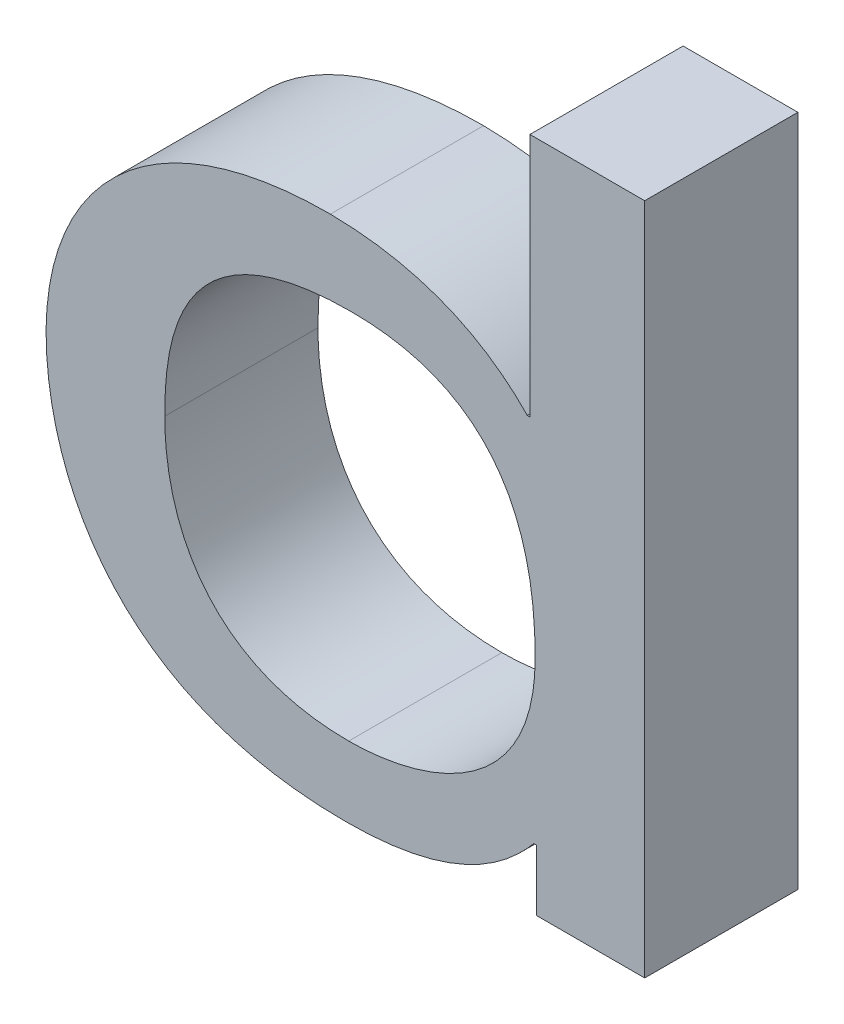
ISO-10303-21;
HEADER;
FILE_DESCRIPTION(('STEP AP214'),'2;1');
FILE_NAME('part.step','',(''),(''),'','','');
FILE_SCHEMA(('AUTOMOTIVE_DESIGN { 1 0 10303 214 1 1 1 1 }'));
ENDSEC;
DATA;
#1=APPLICATION_CONTEXT('core data for automotive mechanical design processes');
#2=APPLICATION_PROTOCOL_DEFINITION('international standard','automotive_design',2000,#1);
#3=PRODUCT_CONTEXT('',#1,'mechanical');
#4=PRODUCT('Part','Part','',(#3));
#5=PRODUCT_RELATED_PRODUCT_CATEGORY('part','',(#4));
#6=PRODUCT_DEFINITION_FORMATION('','',#4);
#7=PRODUCT_DEFINITION_CONTEXT('part definition',#1,'design');
#8=PRODUCT_DEFINITION('design','',#6,#7);
#9=PRODUCT_DEFINITION_SHAPE('','',#8);
#10=(LENGTH_UNIT() NAMED_UNIT(*) SI_UNIT(.MILLI.,.METRE.));
#11=(NAMED_UNIT(*) PLANE_ANGLE_UNIT() SI_UNIT($,.RADIAN.));
#12=(NAMED_UNIT(*) SI_UNIT($,.STERADIAN.) SOLID_ANGLE_UNIT());
#13=UNCERTAINTY_MEASURE_WITH_UNIT(LENGTH_MEASURE(1.E-05),#10,'distance_accuracy_value','');
#14=(GEOMETRIC_REPRESENTATION_CONTEXT(3) GLOBAL_UNCERTAINTY_ASSIGNED_CONTEXT((#13)) GLOBAL_UNIT_ASSIGNED_CONTEXT((#10,
#11,#12)) REPRESENTATION_CONTEXT('',''));
#15=CARTESIAN_POINT('',(0.,0.,0.));
#16=DIRECTION('',(0.,0.,1.));
#17=DIRECTION('',(1.,0.,0.));
#18=AXIS2_PLACEMENT_3D('',#15,#16,#17);
#19=CARTESIAN_POINT('',(-6.552095958079,0.062059271921,-5.499));
#20=CARTESIAN_POINT('',(-6.552095958079,0.062059271921,-6.501));
#21=CARTESIAN_POINT('',(-5.471088891412,0.062059271921,-5.499));
#22=CARTESIAN_POINT('',(-5.471088891412,0.062059271921,-6.501));
#23=CARTESIAN_POINT('',(-5.351652446968,-0.776552772523,-5.499));
#24=CARTESIAN_POINT('',(-5.351652446968,-0.776552772523,-6.501));
#25=CARTESIAN_POINT('',(-5.351652446968,-1.29665163919,-5.499));
#26=CARTESIAN_POINT('',(-5.351652446968,-1.29665163919,-6.501));
#27=(BOUNDED_SURFACE() B_SPLINE_SURFACE(3,1,((#19,#20),(#21,#22),(#23,#24),(#25,#26)),
.UNSPECIFIED.,.F.,.F.,.F.) B_SPLINE_SURFACE_WITH_KNOTS((4,4),(2,2),(0.,1.),(-1.001,0.001),
.UNSPECIFIED.) GEOMETRIC_REPRESENTATION_ITEM() RATIONAL_B_SPLINE_SURFACE(((1.,1.),(1.,1.),(1.,
1.),(1.,1.))) REPRESENTATION_ITEM('') SURFACE());
#28=DIRECTION('',(0.,0.,1.));
#29=VECTOR('',#28,1.);
#30=CARTESIAN_POINT('',(-6.552095958079,0.062059271921,-6.5));
#31=LINE('',#30,#29);
#32=CARTESIAN_POINT('',(-6.552095958079,0.062059271921,-6.5));
#33=VERTEX_POINT('',#32);
#34=CARTESIAN_POINT('',(-6.552095958079,0.062059271921,-5.5));
#35=VERTEX_POINT('',#34);
#36=EDGE_CURVE('E215',#33,#35,#31,.T.);
#37=CARTESIAN_POINT('',(-6.552095958079,0.062059271921,-6.5));
#38=CARTESIAN_POINT('',(-5.471088891412,0.062059271921,-6.5));
#39=CARTESIAN_POINT('',(-5.351652446968,-0.776552772523,-6.5));
#40=CARTESIAN_POINT('',(-5.351652446968,-1.29665163919,-6.5));
#41=(BOUNDED_CURVE() B_SPLINE_CURVE(3,(#37,#38,#39,#40),.UNSPECIFIED.,.F.,
.F.) B_SPLINE_CURVE_WITH_KNOTS((4,4),(0.,1.),
.UNSPECIFIED.) CURVE() GEOMETRIC_REPRESENTATION_ITEM() RATIONAL_B_SPLINE_CURVE((1.,1.,1.,1.)) REPRESENTATION_ITEM(''));
#42=CARTESIAN_POINT('',(-5.351652446968,-1.29665163919,-6.5));
#43=VERTEX_POINT('',#42);
#44=EDGE_CURVE('E213',#33,#43,#41,.T.);
#45=DIRECTION('',(0.,0.,1.));
#46=VECTOR('',#45,1.);
#47=CARTESIAN_POINT('',(-5.351652446968,-1.29665163919,-6.5));
#48=LINE('',#47,#46);
#49=CARTESIAN_POINT('',(-5.351652446968,-1.29665163919,-5.5));
#50=VERTEX_POINT('',#49);
#51=EDGE_CURVE('E11',#43,#50,#48,.T.);
#52=CARTESIAN_POINT('',(-6.552095958079,0.062059271921,-5.5));
#53=CARTESIAN_POINT('',(-5.471088891412,0.062059271921,-5.5));
#54=CARTESIAN_POINT('',(-5.351652446968,-0.776552772523,-5.5));
#55=CARTESIAN_POINT('',(-5.351652446968,-1.29665163919,-5.5));
#56=(BOUNDED_CURVE() B_SPLINE_CURVE(3,(#52,#53,#54,#55),.UNSPECIFIED.,.F.,
.F.) B_SPLINE_CURVE_WITH_KNOTS((4,4),(0.,1.),
.UNSPECIFIED.) CURVE() GEOMETRIC_REPRESENTATION_ITEM() RATIONAL_B_SPLINE_CURVE((1.,1.,1.,1.)) REPRESENTATION_ITEM(''));
#57=EDGE_CURVE('E276',#35,#50,#56,.T.);
#58=ORIENTED_EDGE('',*,*,#36,.F.);
#59=ORIENTED_EDGE('',*,*,#44,.T.);
#60=ORIENTED_EDGE('',*,*,#51,.T.);
#61=ORIENTED_EDGE('',*,*,#57,.F.);
#62=EDGE_LOOP('',(#58,#59,#60,#61));
#63=FACE_BOUND('',#62,.T.);
#64=ADVANCED_FACE('F16',(#63),#27,.F.);
#65=CARTESIAN_POINT('',(-5.351652446968,-1.29665163919,-5.499));
#66=CARTESIAN_POINT('',(-5.351652446968,-1.29665163919,-6.501));
#67=CARTESIAN_POINT('',(-5.351652446968,-2.147396416968,-5.499));
#68=CARTESIAN_POINT('',(-5.351652446968,-2.147396416968,-6.501));
#69=CARTESIAN_POINT('',(-6.092389824746,-2.373871283634,-5.499));
#70=CARTESIAN_POINT('',(-6.092389824746,-2.373871283634,-6.501));
#71=CARTESIAN_POINT('',(-6.568927691412,-2.373871283634,-5.499));
#72=CARTESIAN_POINT('',(-6.568927691412,-2.373871283634,-6.501));
#73=(BOUNDED_SURFACE() B_SPLINE_SURFACE(3,1,((#65,#66),(#67,#68),(#69,#70),(#71,#72)),
.UNSPECIFIED.,.F.,.F.,.F.) B_SPLINE_SURFACE_WITH_KNOTS((4,4),(2,2),(0.,1.),(-1.001,0.001),
.UNSPECIFIED.) GEOMETRIC_REPRESENTATION_ITEM() RATIONAL_B_SPLINE_SURFACE(((1.,1.),(1.,1.),(1.,
1.),(1.,1.))) REPRESENTATION_ITEM('') SURFACE());
#74=CARTESIAN_POINT('',(-5.351652446968,-1.29665163919,-6.5));
#75=CARTESIAN_POINT('',(-5.351652446968,-2.147396416968,-6.5));
#76=CARTESIAN_POINT('',(-6.092389824746,-2.373871283634,-6.5));
#77=CARTESIAN_POINT('',(-6.568927691412,-2.373871283634,-6.5));
#78=(BOUNDED_CURVE() B_SPLINE_CURVE(3,(#74,#75,#76,#77),.UNSPECIFIED.,.F.,
.F.) B_SPLINE_CURVE_WITH_KNOTS((4,4),(0.,1.),
.UNSPECIFIED.) CURVE() GEOMETRIC_REPRESENTATION_ITEM() RATIONAL_B_SPLINE_CURVE((1.,1.,1.,1.)) REPRESENTATION_ITEM(''));
#79=CARTESIAN_POINT('',(-6.568927691412,-2.373871283634,-6.5));
#80=VERTEX_POINT('',#79);
#81=EDGE_CURVE('E206',#43,#80,#78,.T.);
#82=DIRECTION('',(0.,0.,1.));
#83=VECTOR('',#82,1.);
#84=CARTESIAN_POINT('',(-6.568927691412,-2.373871283634,-6.5));
#85=LINE('',#84,#83);
#86=CARTESIAN_POINT('',(-6.568927691412,-2.373871283634,-5.5));
#87=VERTEX_POINT('',#86);
#88=EDGE_CURVE('E29',#80,#87,#85,.T.);
#89=CARTESIAN_POINT('',(-5.351652446968,-1.29665163919,-5.5));
#90=CARTESIAN_POINT('',(-5.351652446968,-2.147396416968,-5.5));
#91=CARTESIAN_POINT('',(-6.092389824746,-2.373871283634,-5.5));
#92=CARTESIAN_POINT('',(-6.568927691412,-2.373871283634,-5.5));
#93=(BOUNDED_CURVE() B_SPLINE_CURVE(3,(#89,#90,#91,#92),.UNSPECIFIED.,.F.,
.F.) B_SPLINE_CURVE_WITH_KNOTS((4,4),(0.,1.),
.UNSPECIFIED.) CURVE() GEOMETRIC_REPRESENTATION_ITEM() RATIONAL_B_SPLINE_CURVE((1.,1.,1.,1.)) REPRESENTATION_ITEM(''));
#94=EDGE_CURVE('E269',#50,#87,#93,.T.);
#95=ORIENTED_EDGE('',*,*,#51,.F.);
#96=ORIENTED_EDGE('',*,*,#81,.T.);
#97=ORIENTED_EDGE('',*,*,#88,.T.);
#98=ORIENTED_EDGE('',*,*,#94,.F.);
#99=EDGE_LOOP('',(#95,#96,#97,#98));
#100=FACE_BOUND('',#99,.T.);
#101=ADVANCED_FACE('F413',(#100),#73,.F.);
#102=CARTESIAN_POINT('',(-6.568927691412,-2.373871283634,-5.499));
#103=CARTESIAN_POINT('',(-6.568927691412,-2.373871283634,-6.501));
#104=CARTESIAN_POINT('',(-7.386277113635,-2.373871283634,-5.499));
#105=CARTESIAN_POINT('',(-7.386277113635,-2.373871283634,-6.501));
#106=CARTESIAN_POINT('',(-7.769492558079,-1.841473172523,-5.499));
#107=CARTESIAN_POINT('',(-7.769492558079,-1.841473172523,-6.501));
#108=CARTESIAN_POINT('',(-7.769492558079,-1.137630705857,-5.499));
#109=CARTESIAN_POINT('',(-7.769492558079,-1.137630705857,-6.501));
#110=(BOUNDED_SURFACE() B_SPLINE_SURFACE(3,1,((#102,#103),(#104,#105),(#106,#107),(#108,#109)),
.UNSPECIFIED.,.F.,.F.,.F.) B_SPLINE_SURFACE_WITH_KNOTS((4,4),(2,2),(0.,1.),(-1.001,0.001),
.UNSPECIFIED.) GEOMETRIC_REPRESENTATION_ITEM() RATIONAL_B_SPLINE_SURFACE(((1.,1.),(1.,1.),(1.,
1.),(1.,1.))) REPRESENTATION_ITEM('') SURFACE());
#111=CARTESIAN_POINT('',(-6.568927691412,-2.373871283634,-6.5));
#112=CARTESIAN_POINT('',(-7.386277113635,-2.373871283634,-6.5));
#113=CARTESIAN_POINT('',(-7.769492558079,-1.841473172523,-6.5));
#114=CARTESIAN_POINT('',(-7.769492558079,-1.137630705857,-6.5));
#115=(BOUNDED_CURVE() B_SPLINE_CURVE(3,(#111,#112,#113,#114),.UNSPECIFIED.,.F.,
.F.) B_SPLINE_CURVE_WITH_KNOTS((4,4),(0.,1.),
.UNSPECIFIED.) CURVE() GEOMETRIC_REPRESENTATION_ITEM() RATIONAL_B_SPLINE_CURVE((1.,1.,1.,1.)) REPRESENTATION_ITEM(''));
#116=CARTESIAN_POINT('',(-7.769492558079,-1.137630705857,-6.5));
#117=VERTEX_POINT('',#116);
#118=EDGE_CURVE('E214',#80,#117,#115,.T.);
#119=DIRECTION('',(0.,0.,1.));
#120=VECTOR('',#119,1.);
#121=CARTESIAN_POINT('',(-7.769492558079,-1.137630705857,-6.5));
#122=LINE('',#121,#120);
#123=CARTESIAN_POINT('',(-7.769492558079,-1.137630705857,-5.5));
#124=VERTEX_POINT('',#123);
#125=EDGE_CURVE('E221',#117,#124,#122,.T.);
#126=CARTESIAN_POINT('',(-6.568927691412,-2.373871283634,-5.5));
#127=CARTESIAN_POINT('',(-7.386277113635,-2.373871283634,-5.5));
#128=CARTESIAN_POINT('',(-7.769492558079,-1.841473172523,-5.5));
#129=CARTESIAN_POINT('',(-7.769492558079,-1.137630705857,-5.5));
#130=(BOUNDED_CURVE() B_SPLINE_CURVE(3,(#126,#127,#128,#129),.UNSPECIFIED.,.F.,
.F.) B_SPLINE_CURVE_WITH_KNOTS((4,4),(0.,1.),
.UNSPECIFIED.) CURVE() GEOMETRIC_REPRESENTATION_ITEM() RATIONAL_B_SPLINE_CURVE((1.,1.,1.,1.)) REPRESENTATION_ITEM(''));
#131=EDGE_CURVE('E275',#87,#124,#130,.T.);
#132=ORIENTED_EDGE('',*,*,#88,.F.);
#133=ORIENTED_EDGE('',*,*,#118,.T.);
#134=ORIENTED_EDGE('',*,*,#125,.T.);
#135=ORIENTED_EDGE('',*,*,#131,.F.);
#136=EDGE_LOOP('',(#132,#133,#134,#135));
#137=FACE_BOUND('',#136,.T.);
#138=ADVANCED_FACE('F417',(#137),#110,.F.);
#139=CARTESIAN_POINT('',(-7.769492558079,-1.137630705857,-5.499));
#140=CARTESIAN_POINT('',(-7.769492558079,-1.137630705857,-6.501));
#141=CARTESIAN_POINT('',(-7.769489735857,-0.727581572523,-5.499));
#142=CARTESIAN_POINT('',(-7.769489735857,-0.727581572523,-6.501));
#143=CARTESIAN_POINT('',(-7.709712246968,0.062059271921,-5.499));
#144=CARTESIAN_POINT('',(-7.709712246968,0.062059271921,-6.501));
#145=CARTESIAN_POINT('',(-6.552095958079,0.062059271921,-5.499));
#146=CARTESIAN_POINT('',(-6.552095958079,0.062059271921,-6.501));
#147=(BOUNDED_SURFACE() B_SPLINE_SURFACE(3,1,((#139,#140),(#141,#142),(#143,#144),(#145,#146)),
.UNSPECIFIED.,.F.,.F.,.F.) B_SPLINE_SURFACE_WITH_KNOTS((4,4),(2,2),(0.,1.),(-1.001,0.001),
.UNSPECIFIED.) GEOMETRIC_REPRESENTATION_ITEM() RATIONAL_B_SPLINE_SURFACE(((1.,1.),(1.,1.),(1.,
1.),(1.,1.))) REPRESENTATION_ITEM('') SURFACE());
#148=CARTESIAN_POINT('',(-7.769492558079,-1.137630705857,-6.5));
#149=CARTESIAN_POINT('',(-7.769489735857,-0.727581572523,-6.5));
#150=CARTESIAN_POINT('',(-7.709712246968,0.062059271921,-6.5));
#151=CARTESIAN_POINT('',(-6.552095958079,0.062059271921,-6.5));
#152=(BOUNDED_CURVE() B_SPLINE_CURVE(3,(#148,#149,#150,#151),.UNSPECIFIED.,.F.,
.F.) B_SPLINE_CURVE_WITH_KNOTS((4,4),(0.,1.),
.UNSPECIFIED.) CURVE() GEOMETRIC_REPRESENTATION_ITEM() RATIONAL_B_SPLINE_CURVE((1.,1.,1.,1.)) REPRESENTATION_ITEM(''));
#153=EDGE_CURVE('E237',#117,#33,#152,.T.);
#154=CARTESIAN_POINT('',(-7.769492558079,-1.137630705857,-5.5));
#155=CARTESIAN_POINT('',(-7.769489735857,-0.727581572523,-5.5));
#156=CARTESIAN_POINT('',(-7.709712246968,0.062059271921,-5.5));
#157=CARTESIAN_POINT('',(-6.552095958079,0.062059271921,-5.5));
#158=(BOUNDED_CURVE() B_SPLINE_CURVE(3,(#154,#155,#156,#157),.UNSPECIFIED.,.F.,
.F.) B_SPLINE_CURVE_WITH_KNOTS((4,4),(0.,1.),
.UNSPECIFIED.) CURVE() GEOMETRIC_REPRESENTATION_ITEM() RATIONAL_B_SPLINE_CURVE((1.,1.,1.,1.)) REPRESENTATION_ITEM(''));
#159=EDGE_CURVE('E300',#124,#35,#158,.T.);
#160=ORIENTED_EDGE('',*,*,#125,.F.);
#161=ORIENTED_EDGE('',*,*,#153,.T.);
#162=ORIENTED_EDGE('',*,*,#36,.T.);
#163=ORIENTED_EDGE('',*,*,#159,.F.);
#164=EDGE_LOOP('',(#160,#161,#162,#163));
#165=FACE_BOUND('',#164,.T.);
#166=ADVANCED_FACE('F406',(#165),#147,.F.);
#167=CARTESIAN_POINT('',(-6.688364135857,0.545409983032,-5.499));
#168=CARTESIAN_POINT('',(-6.688364135857,0.545409983032,-6.501));
#169=CARTESIAN_POINT('',(-7.871704980301,0.545409983032,-5.499));
#170=CARTESIAN_POINT('',(-7.871704980301,0.545409983032,-6.501));
#171=CARTESIAN_POINT('',(-8.544167158079,-0.152296972523,-5.499));
#172=CARTESIAN_POINT('',(-8.544167158079,-0.152296972523,-6.501));
#173=CARTESIAN_POINT('',(-8.544167158079,-1.051984728079,-5.499));
#174=CARTESIAN_POINT('',(-8.544167158079,-1.051984728079,-6.501));
#175=(BOUNDED_SURFACE() B_SPLINE_SURFACE(3,1,((#167,#168),(#169,#170),(#171,#172),(#173,#174)),
.UNSPECIFIED.,.F.,.F.,.F.) B_SPLINE_SURFACE_WITH_KNOTS((4,4),(2,2),(0.,1.),(-1.001,0.001),
.UNSPECIFIED.) GEOMETRIC_REPRESENTATION_ITEM() RATIONAL_B_SPLINE_SURFACE(((1.,1.),(1.,1.),(1.,
1.),(1.,1.))) REPRESENTATION_ITEM('') SURFACE());
#176=DIRECTION('',(0.,0.,1.));
#177=VECTOR('',#176,1.);
#178=CARTESIAN_POINT('',(-6.688364135857,0.545409983032,-6.5));
#179=LINE('',#178,#177);
#180=CARTESIAN_POINT('',(-6.688364135857,0.545409983032,-6.5));
#181=VERTEX_POINT('',#180);
#182=CARTESIAN_POINT('',(-6.688364135857,0.545409983032,-5.5));
#183=VERTEX_POINT('',#182);
#184=EDGE_CURVE('E204',#181,#183,#179,.T.);
#185=CARTESIAN_POINT('',(-6.688364135857,0.545409983032,-6.5));
#186=CARTESIAN_POINT('',(-7.871704980301,0.545409983032,-6.5));
#187=CARTESIAN_POINT('',(-8.544167158079,-0.152296972523,-6.5));
#188=CARTESIAN_POINT('',(-8.544167158079,-1.051984728079,-6.5));
#189=(BOUNDED_CURVE() B_SPLINE_CURVE(3,(#185,#186,#187,#188),.UNSPECIFIED.,.F.,
.F.) B_SPLINE_CURVE_WITH_KNOTS((4,4),(0.,1.),
.UNSPECIFIED.) CURVE() GEOMETRIC_REPRESENTATION_ITEM() RATIONAL_B_SPLINE_CURVE((1.,1.,1.,1.)) REPRESENTATION_ITEM(''));
#190=CARTESIAN_POINT('',(-8.544167158079,-1.051984728079,-6.5));
#191=VERTEX_POINT('',#190);
#192=EDGE_CURVE('E265',#181,#191,#189,.T.);
#193=DIRECTION('',(0.,0.,1.));
#194=VECTOR('',#193,1.);
#195=CARTESIAN_POINT('',(-8.544167158079,-1.051984728079,-6.5));
#196=LINE('',#195,#194);
#197=CARTESIAN_POINT('',(-8.544167158079,-1.051984728079,-5.5));
#198=VERTEX_POINT('',#197);
#199=EDGE_CURVE('E222',#191,#198,#196,.T.);
#200=CARTESIAN_POINT('',(-6.688364135857,0.545409983032,-5.5));
#201=CARTESIAN_POINT('',(-7.871704980301,0.545409983032,-5.5));
#202=CARTESIAN_POINT('',(-8.544167158079,-0.152296972523,-5.5));
#203=CARTESIAN_POINT('',(-8.544167158079,-1.051984728079,-5.5));
#204=(BOUNDED_CURVE() B_SPLINE_CURVE(3,(#200,#201,#202,#203),.UNSPECIFIED.,.F.,
.F.) B_SPLINE_CURVE_WITH_KNOTS((4,4),(0.,1.),
.UNSPECIFIED.) CURVE() GEOMETRIC_REPRESENTATION_ITEM() RATIONAL_B_SPLINE_CURVE((1.,1.,1.,1.)) REPRESENTATION_ITEM(''));
#205=EDGE_CURVE('E20',#183,#198,#204,.T.);
#206=ORIENTED_EDGE('',*,*,#184,.F.);
#207=ORIENTED_EDGE('',*,*,#192,.T.);
#208=ORIENTED_EDGE('',*,*,#199,.T.);
#209=ORIENTED_EDGE('',*,*,#205,.F.);
#210=EDGE_LOOP('',(#206,#207,#208,#209));
#211=FACE_BOUND('',#210,.T.);
#212=ADVANCED_FACE('F389',(#211),#175,.F.);
#213=CARTESIAN_POINT('',(-8.544167158079,-1.051984728079,-5.499));
#214=CARTESIAN_POINT('',(-8.544167158079,-1.051984728079,-6.501));
#215=CARTESIAN_POINT('',(-8.544167158079,-1.816917016968,-5.499));
#216=CARTESIAN_POINT('',(-8.544167158079,-1.816917016968,-6.501));
#217=CARTESIAN_POINT('',(-8.101292758079,-2.839106150301,-5.499));
#218=CARTESIAN_POINT('',(-8.101292758079,-2.839106150301,-6.501));
#219=CARTESIAN_POINT('',(-6.586030358079,-2.839106150301,-5.499));
#220=CARTESIAN_POINT('',(-6.586030358079,-2.839106150301,-6.501));
#221=(BOUNDED_SURFACE() B_SPLINE_SURFACE(3,1,((#213,#214),(#215,#216),(#217,#218),(#219,#220)),
.UNSPECIFIED.,.F.,.F.,.F.) B_SPLINE_SURFACE_WITH_KNOTS((4,4),(2,2),(0.,1.),(-1.001,0.001),
.UNSPECIFIED.) GEOMETRIC_REPRESENTATION_ITEM() RATIONAL_B_SPLINE_SURFACE(((1.,1.),(1.,1.),(1.,
1.),(1.,1.))) REPRESENTATION_ITEM('') SURFACE());
#222=CARTESIAN_POINT('',(-8.544167158079,-1.051984728079,-6.5));
#223=CARTESIAN_POINT('',(-8.544167158079,-1.816917016968,-6.5));
#224=CARTESIAN_POINT('',(-8.101292758079,-2.839106150301,-6.5));
#225=CARTESIAN_POINT('',(-6.586030358079,-2.839106150301,-6.5));
#226=(BOUNDED_CURVE() B_SPLINE_CURVE(3,(#222,#223,#224,#225),.UNSPECIFIED.,.F.,
.F.) B_SPLINE_CURVE_WITH_KNOTS((4,4),(0.,1.),
.UNSPECIFIED.) CURVE() GEOMETRIC_REPRESENTATION_ITEM() RATIONAL_B_SPLINE_CURVE((1.,1.,1.,1.)) REPRESENTATION_ITEM(''));
#227=CARTESIAN_POINT('',(-6.586030358079,-2.839106150301,-6.5));
#228=VERTEX_POINT('',#227);
#229=EDGE_CURVE('E301',#191,#228,#226,.T.);
#230=DIRECTION('',(0.,0.,1.));
#231=VECTOR('',#230,1.);
#232=CARTESIAN_POINT('',(-6.586030358079,-2.839106150301,-6.5));
#233=LINE('',#232,#231);
#234=CARTESIAN_POINT('',(-6.586030358079,-2.839106150301,-5.5));
#235=VERTEX_POINT('',#234);
#236=EDGE_CURVE('E255',#228,#235,#233,.T.);
#237=CARTESIAN_POINT('',(-8.544167158079,-1.051984728079,-5.5));
#238=CARTESIAN_POINT('',(-8.544167158079,-1.816917016968,-5.5));
#239=CARTESIAN_POINT('',(-8.101292758079,-2.839106150301,-5.5));
#240=CARTESIAN_POINT('',(-6.586030358079,-2.839106150301,-5.5));
#241=(BOUNDED_CURVE() B_SPLINE_CURVE(3,(#237,#238,#239,#240),.UNSPECIFIED.,.F.,
.F.) B_SPLINE_CURVE_WITH_KNOTS((4,4),(0.,1.),
.UNSPECIFIED.) CURVE() GEOMETRIC_REPRESENTATION_ITEM() RATIONAL_B_SPLINE_CURVE((1.,1.,1.,1.)) REPRESENTATION_ITEM(''));
#242=EDGE_CURVE('E192',#198,#235,#241,.T.);
#243=ORIENTED_EDGE('',*,*,#199,.F.);
#244=ORIENTED_EDGE('',*,*,#229,.T.);
#245=ORIENTED_EDGE('',*,*,#236,.T.);
#246=ORIENTED_EDGE('',*,*,#242,.F.);
#247=EDGE_LOOP('',(#243,#244,#245,#246));
#248=FACE_BOUND('',#247,.T.);
#249=ADVANCED_FACE('F397',(#248),#221,.F.);
#250=CARTESIAN_POINT('',(-5.4021351327657,0.0490527706217003,-6.5));
#251=CARTESIAN_POINT('',(-5.47669706060502,0.126754741088386,-6.5));
#252=CARTESIAN_POINT('',(-5.56076070012345,0.19246309660675,-6.5));
#253=CARTESIAN_POINT('',(-6.00231180829946,0.537601581708812,-6.50000000000001));
#254=CARTESIAN_POINT('',(-6.6893642129756,0.545421548348022,-6.5));
#255=CARTESIAN_POINT('',(-5.4021351327657,0.0490527706217003,-5.5));
#256=CARTESIAN_POINT('',(-5.47669706060502,0.126754741088386,-5.50000000000001));
#257=CARTESIAN_POINT('',(-5.56076070012345,0.19246309660675,-5.5));
#258=CARTESIAN_POINT('',(-6.00231180829946,0.537601581708812,-5.5));
#259=CARTESIAN_POINT('',(-6.6893642129756,0.545421548348022,-5.5));
#260=(BOUNDED_SURFACE() B_SPLINE_SURFACE(1,2,((#250,#251,#252,#253,#254),(#255,#256,#257,#258,
#259)),.UNSPECIFIED.,.F.,.F.,.F.) B_SPLINE_SURFACE_WITH_KNOTS((2,2),(3,2,3),
(-0.0613031214211662,-6.12418795416167E-05),(50.5197518120979,51.2981096776191,
55.2375927610218),
.UNSPECIFIED.) GEOMETRIC_REPRESENTATION_ITEM() RATIONAL_B_SPLINE_SURFACE(((0.982762913747854,
0.991111729377399,1.,0.955014019502462,0.923846989471058),(0.982762913747854,0.991111729377399,
1.,0.955014019502462,0.923846989471058))) REPRESENTATION_ITEM('') SURFACE());
#261=DIRECTION('',(0.,0.,1.));
#262=VECTOR('',#261,1.);
#263=CARTESIAN_POINT('',(-5.402827802523,0.049774138588,-6.5));
#264=LINE('',#263,#262);
#265=CARTESIAN_POINT('',(-5.402827802523,0.049774138588,-6.5));
#266=VERTEX_POINT('',#265);
#267=CARTESIAN_POINT('',(-5.402827802523,0.049774138588,-5.5));
#268=VERTEX_POINT('',#267);
#269=EDGE_CURVE('E178',#266,#268,#264,.T.);
#270=CARTESIAN_POINT('',(-15.6166211233123,-12.6724491203319,-6.5));
#271=DIRECTION('',(0.,0.,1.));
#272=DIRECTION('',(0.615839792717633,0.787871404294827,0.));
#273=AXIS2_PLACEMENT_3D('',#270,#271,#272);
#274=ELLIPSE('',#273,16.3286954531033,4.92813404408949);
#275=EDGE_CURVE('E260',#266,#181,#274,.T.);
#276=CARTESIAN_POINT('',(-15.6166211233922,-12.6724491204391,-5.5));
#277=DIRECTION('',(0.,0.,1.));
#278=DIRECTION('',(0.61583979271747,0.787871404294954,0.));
#279=AXIS2_PLACEMENT_3D('',#276,#277,#278);
#280=ELLIPSE('',#279,16.3286954532368,4.92813404410974);
#281=EDGE_CURVE('E229',#268,#183,#280,.T.);
#282=ORIENTED_EDGE('',*,*,#269,.F.);
#283=ORIENTED_EDGE('',*,*,#275,.T.);
#284=ORIENTED_EDGE('',*,*,#184,.T.);
#285=ORIENTED_EDGE('',*,*,#281,.F.);
#286=EDGE_LOOP('',(#282,#283,#284,#285));
#287=FACE_BOUND('',#286,.T.);
#288=ADVANCED_FACE('F385',(#287),#260,.F.);
#289=CARTESIAN_POINT('',(-6.586030358079,-2.839106150301,-5.49857841752785));
#290=CARTESIAN_POINT('',(-6.586030358079,-2.839106150301,-6.50142158247215));
#291=CARTESIAN_POINT('',(-5.828461246968,-2.839106150301,-5.49857841752785));
#292=CARTESIAN_POINT('',(-5.828461246968,-2.839106150301,-6.50142158247215));
#293=CARTESIAN_POINT('',(-5.513642358079,-2.526818794746,-5.49857841752785));
#294=CARTESIAN_POINT('',(-5.513642358079,-2.526818794746,-6.50142158247215));
#295=CARTESIAN_POINT('',(-5.360271513635,-2.349453416968,-5.49857841752785));
#296=CARTESIAN_POINT('',(-5.360271513635,-2.349453416968,-6.50142158247215));
#297=(BOUNDED_SURFACE() B_SPLINE_SURFACE(3,1,((#289,#290),(#291,#292),(#293,#294),(#295,#296)),
.UNSPECIFIED.,.F.,.F.,.F.) B_SPLINE_SURFACE_WITH_KNOTS((4,4),(2,2),(0.,1.),(-1.00142158247215,
0.00142158247215468),
.UNSPECIFIED.) GEOMETRIC_REPRESENTATION_ITEM() RATIONAL_B_SPLINE_SURFACE(((1.,1.),(1.,1.),(1.,
1.),(1.,1.))) REPRESENTATION_ITEM('') SURFACE());
#298=CARTESIAN_POINT('',(-6.586030358079,-2.839106150301,-6.5));
#299=CARTESIAN_POINT('',(-5.828461246968,-2.839106150301,-6.5));
#300=CARTESIAN_POINT('',(-5.513642358079,-2.526818794746,-6.5));
#301=CARTESIAN_POINT('',(-5.360271513635,-2.349453416968,-6.5));
#302=(BOUNDED_CURVE() B_SPLINE_CURVE(3,(#298,#299,#300,#301),.UNSPECIFIED.,.F.,
.F.) B_SPLINE_CURVE_WITH_KNOTS((4,4),(0.,1.),
.UNSPECIFIED.) CURVE() GEOMETRIC_REPRESENTATION_ITEM() RATIONAL_B_SPLINE_CURVE((1.,1.,1.,1.)) REPRESENTATION_ITEM(''));
#303=CARTESIAN_POINT('',(-5.360271513635,-2.349453416968,-6.5));
#304=VERTEX_POINT('',#303);
#305=EDGE_CURVE('E173',#228,#304,#302,.T.);
#306=DIRECTION('',(0.,0.,1.));
#307=VECTOR('',#306,1.);
#308=CARTESIAN_POINT('',(-5.360271513635,-2.349453416968,-6.5));
#309=LINE('',#308,#307);
#310=CARTESIAN_POINT('',(-5.360271513635,-2.349453416968,-5.5));
#311=VERTEX_POINT('',#310);
#312=EDGE_CURVE('E166',#304,#311,#309,.T.);
#313=CARTESIAN_POINT('',(-6.586030358079,-2.839106150301,-5.5));
#314=CARTESIAN_POINT('',(-5.828461246968,-2.839106150301,-5.5));
#315=CARTESIAN_POINT('',(-5.513642358079,-2.526818794746,-5.5));
#316=CARTESIAN_POINT('',(-5.360271513635,-2.349453416968,-5.5));
#317=(BOUNDED_CURVE() B_SPLINE_CURVE(3,(#313,#314,#315,#316),.UNSPECIFIED.,.F.,
.F.) B_SPLINE_CURVE_WITH_KNOTS((4,4),(0.,1.),
.UNSPECIFIED.) CURVE() GEOMETRIC_REPRESENTATION_ITEM() RATIONAL_B_SPLINE_CURVE((1.,1.,1.,1.)) REPRESENTATION_ITEM(''));
#318=EDGE_CURVE('E170',#235,#311,#317,.T.);
#319=ORIENTED_EDGE('',*,*,#236,.F.);
#320=ORIENTED_EDGE('',*,*,#305,.T.);
#321=ORIENTED_EDGE('',*,*,#312,.T.);
#322=ORIENTED_EDGE('',*,*,#318,.F.);
#323=EDGE_LOOP('',(#319,#320,#321,#322));
#324=FACE_BOUND('',#323,.T.);
#325=ADVANCED_FACE('F168',(#324),#297,.F.);
#326=CARTESIAN_POINT('',(-5.3944119358565,0.049774138588,-5.49));
#327=DIRECTION('',(0.,-1.,0.));
#328=DIRECTION('',(0.,0.,1.));
#329=AXIS2_PLACEMENT_3D('',#326,#327,#328);
#330=PLANE('',#329);
#331=DIRECTION('',(0.,0.,1.));
#332=VECTOR('',#331,1.);
#333=CARTESIAN_POINT('',(-5.38599606919,0.049774138588,-6.5));
#334=LINE('',#333,#332);
#335=CARTESIAN_POINT('',(-5.38599606919,0.049774138588,-6.5));
#336=VERTEX_POINT('',#335);
#337=CARTESIAN_POINT('',(-5.38599606919,0.049774138588,-5.5));
#338=VERTEX_POINT('',#337);
#339=EDGE_CURVE('E179',#336,#338,#334,.T.);
#340=ORIENTED_EDGE('',*,*,#339,.F.);
#341=DIRECTION('',(-1.,0.,0.));
#342=VECTOR('',#341,1.);
#343=CARTESIAN_POINT('',(-5.38599606919,0.049774138588,-6.5));
#344=LINE('',#343,#342);
#345=EDGE_CURVE('E264',#336,#266,#344,.T.);
#346=ORIENTED_EDGE('',*,*,#345,.T.);
#347=ORIENTED_EDGE('',*,*,#269,.T.);
#348=DIRECTION('',(-1.,0.,0.));
#349=VECTOR('',#348,1.);
#350=CARTESIAN_POINT('',(-5.38599606919,0.049774138588,-5.5));
#351=LINE('',#350,#349);
#352=EDGE_CURVE('E225',#338,#268,#351,.T.);
#353=ORIENTED_EDGE('',*,*,#352,.F.);
#354=EDGE_LOOP('',(#340,#346,#347,#353));
#355=FACE_BOUND('',#354,.T.);
#356=ADVANCED_FACE('F392',(#355),#330,.F.);
#357=CARTESIAN_POINT('',(-5.351855646968,-2.349453416968,-5.49));
#358=DIRECTION('',(0.,1.,0.));
#359=DIRECTION('',(-1.,0.,0.));
#360=AXIS2_PLACEMENT_3D('',#357,#358,#359);
#361=PLANE('',#360);
#362=ORIENTED_EDGE('',*,*,#312,.F.);
#363=DIRECTION('',(1.,0.,0.));
#364=VECTOR('',#363,1.);
#365=CARTESIAN_POINT('',(-5.360271513635,-2.349453416968,-6.5));
#366=LINE('',#365,#364);
#367=CARTESIAN_POINT('',(-5.343439780301,-2.349453416968,-6.5));
#368=VERTEX_POINT('',#367);
#369=EDGE_CURVE('E256',#304,#368,#366,.T.);
#370=ORIENTED_EDGE('',*,*,#369,.T.);
#371=DIRECTION('',(0.,0.,1.));
#372=VECTOR('',#371,1.);
#373=CARTESIAN_POINT('',(-5.343439780301,-2.349453416968,-6.5));
#374=LINE('',#373,#372);
#375=CARTESIAN_POINT('',(-5.343439780301,-2.349453416968,-5.5));
#376=VERTEX_POINT('',#375);
#377=EDGE_CURVE('E184',#368,#376,#374,.T.);
#378=ORIENTED_EDGE('',*,*,#377,.T.);
#379=DIRECTION('',(1.,0.,0.));
#380=VECTOR('',#379,1.);
#381=CARTESIAN_POINT('',(-5.360271513635,-2.349453416968,-5.5));
#382=LINE('',#381,#380);
#383=EDGE_CURVE('E182',#311,#376,#382,.T.);
#384=ORIENTED_EDGE('',*,*,#383,.F.);
#385=EDGE_LOOP('',(#362,#370,#378,#384));
#386=FACE_BOUND('',#385,.T.);
#387=ADVANCED_FACE('F183',(#386),#361,.F.);
#388=CARTESIAN_POINT('',(-5.38599606919,0.84836566081,-5.49));
#389=DIRECTION('',(1.,0.,0.));
#390=DIRECTION('',(0.,0.,-1.));
#391=AXIS2_PLACEMENT_3D('',#388,#389,#390);
#392=PLANE('',#391);
#393=DIRECTION('',(0.,0.,1.));
#394=VECTOR('',#393,1.);
#395=CARTESIAN_POINT('',(-5.38599606919,1.646957183032,-6.5));
#396=LINE('',#395,#394);
#397=CARTESIAN_POINT('',(-5.38599606919,1.646957183032,-6.5));
#398=VERTEX_POINT('',#397);
#399=CARTESIAN_POINT('',(-5.38599606919,1.646957183032,-5.5));
#400=VERTEX_POINT('',#399);
#401=EDGE_CURVE('E231',#398,#400,#396,.T.);
#402=ORIENTED_EDGE('',*,*,#401,.F.);
#403=DIRECTION('',(0.,-1.,0.));
#404=VECTOR('',#403,1.);
#405=CARTESIAN_POINT('',(-5.38599606919,1.646957183032,-6.5));
#406=LINE('',#405,#404);
#407=EDGE_CURVE('E243',#398,#336,#406,.T.);
#408=ORIENTED_EDGE('',*,*,#407,.T.);
#409=ORIENTED_EDGE('',*,*,#339,.T.);
#410=DIRECTION('',(0.,-1.,0.));
#411=VECTOR('',#410,1.);
#412=CARTESIAN_POINT('',(-5.38599606919,1.646957183032,-5.5));
#413=LINE('',#412,#411);
#414=EDGE_CURVE('E230',#400,#338,#413,.T.);
#415=ORIENTED_EDGE('',*,*,#414,.F.);
#416=EDGE_LOOP('',(#402,#408,#409,#415));
#417=FACE_BOUND('',#416,.T.);
#418=ADVANCED_FACE('F422',(#417),#392,.F.);
#419=CARTESIAN_POINT('',(-5.343439780301,-2.5483438836345,-5.49));
#420=DIRECTION('',(1.,0.,0.));
#421=DIRECTION('',(0.,0.,-1.));
#422=AXIS2_PLACEMENT_3D('',#419,#420,#421);
#423=PLANE('',#422);
#424=ORIENTED_EDGE('',*,*,#377,.F.);
#425=DIRECTION('',(0.,-1.,0.));
#426=VECTOR('',#425,1.);
#427=CARTESIAN_POINT('',(-5.343439780301,-2.349453416968,-6.5));
#428=LINE('',#427,#426);
#429=CARTESIAN_POINT('',(-5.343439780301,-2.747234350301,-6.5));
#430=VERTEX_POINT('',#429);
#431=EDGE_CURVE('E259',#368,#430,#428,.T.);
#432=ORIENTED_EDGE('',*,*,#431,.T.);
#433=DIRECTION('',(0.,0.,1.));
#434=VECTOR('',#433,1.);
#435=CARTESIAN_POINT('',(-5.343439780301,-2.747234350301,-6.5));
#436=LINE('',#435,#434);
#437=CARTESIAN_POINT('',(-5.343439780301,-2.747234350301,-5.5));
#438=VERTEX_POINT('',#437);
#439=EDGE_CURVE('E310',#430,#438,#436,.T.);
#440=ORIENTED_EDGE('',*,*,#439,.T.);
#441=DIRECTION('',(0.,-1.,0.));
#442=VECTOR('',#441,1.);
#443=CARTESIAN_POINT('',(-5.343439780301,-2.349453416968,-5.5));
#444=LINE('',#443,#442);
#445=EDGE_CURVE('E187',#376,#438,#444,.T.);
#446=ORIENTED_EDGE('',*,*,#445,.F.);
#447=EDGE_LOOP('',(#424,#432,#440,#446));
#448=FACE_BOUND('',#447,.T.);
#449=ADVANCED_FACE('F18',(#448),#423,.F.);
#450=CARTESIAN_POINT('',(-6.213670613512,-0.803523706298,-5.5));
#451=DIRECTION('',(0.,0.,1.));
#452=DIRECTION('',(0.,-1.,0.));
#453=AXIS2_PLACEMENT_3D('',#450,#451,#452);
#454=PLANE('',#453);
#455=ORIENTED_EDGE('',*,*,#159,.T.);
#456=ORIENTED_EDGE('',*,*,#57,.T.);
#457=ORIENTED_EDGE('',*,*,#94,.T.);
#458=ORIENTED_EDGE('',*,*,#131,.T.);
#459=EDGE_LOOP('',(#455,#456,#457,#458));
#460=FACE_BOUND('',#459,.T.);
#461=DIRECTION('',(0.,1.,0.));
#462=VECTOR('',#461,1.);
#463=CARTESIAN_POINT('',(-4.636650913635,-2.747234350301,-5.5));
#464=LINE('',#463,#462);
#465=CARTESIAN_POINT('',(-4.636650913635,-2.747234350301,-5.5));
#466=VERTEX_POINT('',#465);
#467=CARTESIAN_POINT('',(-4.636650913635,1.646957183032,-5.5));
#468=VERTEX_POINT('',#467);
#469=EDGE_CURVE('E317',#466,#468,#464,.T.);
#470=ORIENTED_EDGE('',*,*,#469,.T.);
#471=DIRECTION('',(-1.,0.,0.));
#472=VECTOR('',#471,1.);
#473=CARTESIAN_POINT('',(-4.636650913635,1.646957183032,-5.5));
#474=LINE('',#473,#472);
#475=EDGE_CURVE('E235',#468,#400,#474,.T.);
#476=ORIENTED_EDGE('',*,*,#475,.T.);
#477=ORIENTED_EDGE('',*,*,#414,.T.);
#478=ORIENTED_EDGE('',*,*,#352,.T.);
#479=ORIENTED_EDGE('',*,*,#281,.T.);
#480=ORIENTED_EDGE('',*,*,#205,.T.);
#481=ORIENTED_EDGE('',*,*,#242,.T.);
#482=ORIENTED_EDGE('',*,*,#318,.T.);
#483=ORIENTED_EDGE('',*,*,#383,.T.);
#484=ORIENTED_EDGE('',*,*,#445,.T.);
#485=DIRECTION('',(1.,0.,0.));
#486=VECTOR('',#485,1.);
#487=CARTESIAN_POINT('',(-5.343439780301,-2.747234350301,-5.5));
#488=LINE('',#487,#486);
#489=EDGE_CURVE('E75',#438,#466,#488,.T.);
#490=ORIENTED_EDGE('',*,*,#489,.T.);
#491=EDGE_LOOP('',(#470,#476,#477,#478,#479,#480,#481,#482,#483,#484,#490));
#492=FACE_BOUND('',#491,.T.);
#493=ADVANCED_FACE('F189',(#460,#492),#454,.T.);
#494=CARTESIAN_POINT('',(-6.213670613512,-0.803523706298,-6.5));
#495=DIRECTION('',(0.,0.,1.));
#496=DIRECTION('',(0.,-1.,0.));
#497=AXIS2_PLACEMENT_3D('',#494,#495,#496);
#498=PLANE('',#497);
#499=ORIENTED_EDGE('',*,*,#153,.F.);
#500=ORIENTED_EDGE('',*,*,#118,.F.);
#501=ORIENTED_EDGE('',*,*,#81,.F.);
#502=ORIENTED_EDGE('',*,*,#44,.F.);
#503=EDGE_LOOP('',(#499,#500,#501,#502));
#504=FACE_BOUND('',#503,.T.);
#505=DIRECTION('',(0.,1.,0.));
#506=VECTOR('',#505,1.);
#507=CARTESIAN_POINT('',(-4.636650913635,-2.747234350301,-6.5));
#508=LINE('',#507,#506);
#509=CARTESIAN_POINT('',(-4.636650913635,-2.747234350301,-6.5));
#510=VERTEX_POINT('',#509);
#511=CARTESIAN_POINT('',(-4.636650913635,1.646957183032,-6.5));
#512=VERTEX_POINT('',#511);
#513=EDGE_CURVE('E331',#510,#512,#508,.T.);
#514=ORIENTED_EDGE('',*,*,#513,.F.);
#515=DIRECTION('',(1.,0.,0.));
#516=VECTOR('',#515,1.);
#517=CARTESIAN_POINT('',(-5.343439780301,-2.747234350301,-6.5));
#518=LINE('',#517,#516);
#519=EDGE_CURVE('E90',#430,#510,#518,.T.);
#520=ORIENTED_EDGE('',*,*,#519,.F.);
#521=ORIENTED_EDGE('',*,*,#431,.F.);
#522=ORIENTED_EDGE('',*,*,#369,.F.);
#523=ORIENTED_EDGE('',*,*,#305,.F.);
#524=ORIENTED_EDGE('',*,*,#229,.F.);
#525=ORIENTED_EDGE('',*,*,#192,.F.);
#526=ORIENTED_EDGE('',*,*,#275,.F.);
#527=ORIENTED_EDGE('',*,*,#345,.F.);
#528=ORIENTED_EDGE('',*,*,#407,.F.);
#529=DIRECTION('',(-1.,0.,0.));
#530=VECTOR('',#529,1.);
#531=CARTESIAN_POINT('',(-4.636650913635,1.646957183032,-6.5));
#532=LINE('',#531,#530);
#533=EDGE_CURVE('E236',#512,#398,#532,.T.);
#534=ORIENTED_EDGE('',*,*,#533,.F.);
#535=EDGE_LOOP('',(#514,#520,#521,#522,#523,#524,#525,#526,#527,#528,#534));
#536=FACE_BOUND('',#535,.T.);
#537=ADVANCED_FACE('F395',(#504,#536),#498,.F.);
#538=CARTESIAN_POINT('',(-5.0113234914125,1.646957183032,-5.49));
#539=DIRECTION('',(0.,-1.,0.));
#540=DIRECTION('',(0.,0.,1.));
#541=AXIS2_PLACEMENT_3D('',#538,#539,#540);
#542=PLANE('',#541);
#543=DIRECTION('',(0.,0.,1.));
#544=VECTOR('',#543,1.);
#545=CARTESIAN_POINT('',(-4.636650913635,1.646957183032,-6.5));
#546=LINE('',#545,#544);
#547=EDGE_CURVE('E358',#512,#468,#546,.T.);
#548=ORIENTED_EDGE('',*,*,#547,.F.);
#549=ORIENTED_EDGE('',*,*,#533,.T.);
#550=ORIENTED_EDGE('',*,*,#401,.T.);
#551=ORIENTED_EDGE('',*,*,#475,.F.);
#552=EDGE_LOOP('',(#548,#549,#550,#551));
#553=FACE_BOUND('',#552,.T.);
#554=ADVANCED_FACE('F433',(#553),#542,.F.);
#555=CARTESIAN_POINT('',(-4.990045346968,-2.747234350301,-5.49));
#556=DIRECTION('',(0.,1.,0.));
#557=DIRECTION('',(-1.,0.,0.));
#558=AXIS2_PLACEMENT_3D('',#555,#556,#557);
#559=PLANE('',#558);
#560=ORIENTED_EDGE('',*,*,#439,.F.);
#561=ORIENTED_EDGE('',*,*,#519,.T.);
#562=DIRECTION('',(0.,0.,1.));
#563=VECTOR('',#562,1.);
#564=CARTESIAN_POINT('',(-4.636650913635,-2.747234350301,-6.5));
#565=LINE('',#564,#563);
#566=EDGE_CURVE('E328',#510,#466,#565,.T.);
#567=ORIENTED_EDGE('',*,*,#566,.T.);
#568=ORIENTED_EDGE('',*,*,#489,.F.);
#569=EDGE_LOOP('',(#560,#561,#567,#568));
#570=FACE_BOUND('',#569,.T.);
#571=ADVANCED_FACE('F441',(#570),#559,.F.);
#572=CARTESIAN_POINT('',(-4.636650913635,-0.5501385836345,-5.49));
#573=DIRECTION('',(-1.,0.,0.));
#574=DIRECTION('',(0.,1.,0.));
#575=AXIS2_PLACEMENT_3D('',#572,#573,#574);
#576=PLANE('',#575);
#577=ORIENTED_EDGE('',*,*,#566,.F.);
#578=ORIENTED_EDGE('',*,*,#513,.T.);
#579=ORIENTED_EDGE('',*,*,#547,.T.);
#580=ORIENTED_EDGE('',*,*,#469,.F.);
#581=EDGE_LOOP('',(#577,#578,#579,#580));
#582=FACE_BOUND('',#581,.T.);
#583=ADVANCED_FACE('F452',(#582),#576,.F.);
#584=CLOSED_SHELL('',(#64,#101,#138,#166,#212,#249,#288,#325,#356,#387,#418,#449,#493,#537,#554,
#571,#583));
#585=MANIFOLD_SOLID_BREP('B1',#584);
#586=ADVANCED_BREP_SHAPE_REPRESENTATION('',(#18,#585),#14);
#587=SHAPE_DEFINITION_REPRESENTATION(#9,#586);
ENDSEC;
END-ISO-10303-21;
